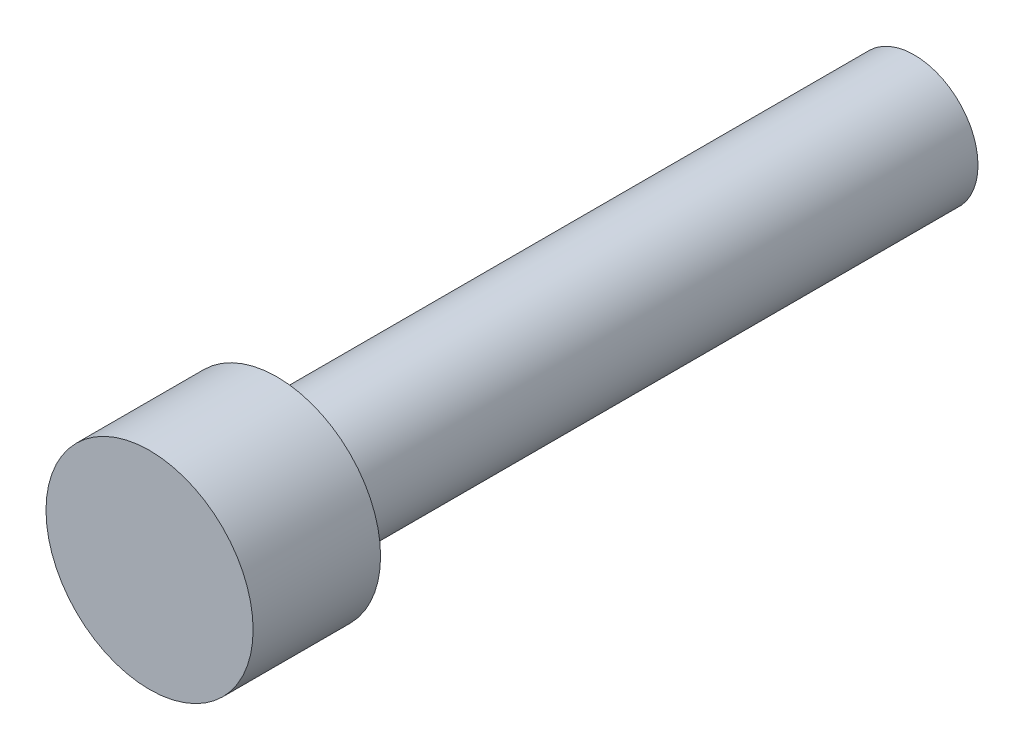
ISO-10303-21;
HEADER;
FILE_DESCRIPTION(('STEP AP214'),'2;1');
FILE_NAME('part.step','',(''),(''),'','','');
FILE_SCHEMA(('AUTOMOTIVE_DESIGN { 1 0 10303 214 1 1 1 1 }'));
ENDSEC;
DATA;
#1=APPLICATION_CONTEXT('core data for automotive mechanical design processes');
#2=APPLICATION_PROTOCOL_DEFINITION('international standard','automotive_design',2000,#1);
#3=PRODUCT_CONTEXT('',#1,'mechanical');
#4=PRODUCT('Part','Part','',(#3));
#5=PRODUCT_RELATED_PRODUCT_CATEGORY('part','',(#4));
#6=PRODUCT_DEFINITION_FORMATION('','',#4);
#7=PRODUCT_DEFINITION_CONTEXT('part definition',#1,'design');
#8=PRODUCT_DEFINITION('design','',#6,#7);
#9=PRODUCT_DEFINITION_SHAPE('','',#8);
#10=(LENGTH_UNIT() NAMED_UNIT(*) SI_UNIT(.MILLI.,.METRE.));
#11=(NAMED_UNIT(*) PLANE_ANGLE_UNIT() SI_UNIT($,.RADIAN.));
#12=(NAMED_UNIT(*) SI_UNIT($,.STERADIAN.) SOLID_ANGLE_UNIT());
#13=UNCERTAINTY_MEASURE_WITH_UNIT(LENGTH_MEASURE(1.E-05),#10,'distance_accuracy_value','');
#14=(GEOMETRIC_REPRESENTATION_CONTEXT(3) GLOBAL_UNCERTAINTY_ASSIGNED_CONTEXT((#13)) GLOBAL_UNIT_ASSIGNED_CONTEXT((#10,
#11,#12)) REPRESENTATION_CONTEXT('',''));
#15=CARTESIAN_POINT('',(0.,0.,0.));
#16=DIRECTION('',(0.,0.,1.));
#17=DIRECTION('',(1.,0.,0.));
#18=AXIS2_PLACEMENT_3D('',#15,#16,#17);
#19=CARTESIAN_POINT('',(0.,0.,8.));
#20=DIRECTION('',(0.,0.,-1.));
#21=DIRECTION('',(-1.,0.,0.));
#22=AXIS2_PLACEMENT_3D('',#19,#20,#21);
#23=CYLINDRICAL_SURFACE('',#22,6.5);
#24=CARTESIAN_POINT('',(0.,0.,8.));
#25=DIRECTION('',(0.,0.,1.));
#26=DIRECTION('',(1.,0.,0.));
#27=AXIS2_PLACEMENT_3D('',#24,#25,#26);
#28=CIRCLE('',#27,6.5);
#29=CARTESIAN_POINT('',(6.5,0.,8.));
#30=VERTEX_POINT('',#29);
#31=EDGE_CURVE('E10',#30,#30,#28,.T.);
#32=ORIENTED_EDGE('',*,*,#31,.F.);
#33=EDGE_LOOP('',(#32));
#34=FACE_BOUND('',#33,.T.);
#35=CARTESIAN_POINT('',(0.,0.,0.));
#36=DIRECTION('',(0.,0.,1.));
#37=DIRECTION('',(1.,0.,0.));
#38=AXIS2_PLACEMENT_3D('',#35,#36,#37);
#39=CIRCLE('',#38,6.5);
#40=CARTESIAN_POINT('',(6.5,0.,0.));
#41=VERTEX_POINT('',#40);
#42=EDGE_CURVE('E37',#41,#41,#39,.T.);
#43=ORIENTED_EDGE('',*,*,#42,.T.);
#44=EDGE_LOOP('',(#43));
#45=FACE_BOUND('',#44,.T.);
#46=ADVANCED_FACE('F40',(#34,#45),#23,.T.);
#47=CARTESIAN_POINT('',(0.,0.,8.));
#48=DIRECTION('',(0.,0.,1.));
#49=DIRECTION('',(1.,0.,0.));
#50=AXIS2_PLACEMENT_3D('',#47,#48,#49);
#51=PLANE('',#50);
#52=ORIENTED_EDGE('',*,*,#31,.T.);
#53=EDGE_LOOP('',(#52));
#54=FACE_BOUND('',#53,.T.);
#55=ADVANCED_FACE('F70',(#54),#51,.T.);
#56=CARTESIAN_POINT('',(0.,0.,0.));
#57=DIRECTION('',(0.,0.,1.));
#58=DIRECTION('',(1.,0.,0.));
#59=AXIS2_PLACEMENT_3D('',#56,#57,#58);
#60=PLANE('',#59);
#61=CARTESIAN_POINT('',(0.,0.,0.));
#62=DIRECTION('',(0.,0.,1.));
#63=DIRECTION('',(1.,0.,0.));
#64=AXIS2_PLACEMENT_3D('',#61,#62,#63);
#65=CIRCLE('',#64,4.);
#66=CARTESIAN_POINT('',(4.,0.,0.));
#67=VERTEX_POINT('',#66);
#68=EDGE_CURVE('E47',#67,#67,#65,.T.);
#69=ORIENTED_EDGE('',*,*,#68,.T.);
#70=EDGE_LOOP('',(#69));
#71=FACE_BOUND('',#70,.T.);
#72=ORIENTED_EDGE('',*,*,#42,.F.);
#73=EDGE_LOOP('',(#72));
#74=FACE_BOUND('',#73,.T.);
#75=ADVANCED_FACE('F65',(#71,#74),#60,.F.);
#76=CARTESIAN_POINT('',(0.,0.,-40.));
#77=DIRECTION('',(0.,0.,1.));
#78=DIRECTION('',(1.,0.,0.));
#79=AXIS2_PLACEMENT_3D('',#76,#77,#78);
#80=CYLINDRICAL_SURFACE('',#79,4.);
#81=CARTESIAN_POINT('',(0.,0.,-40.));
#82=DIRECTION('',(0.,0.,1.));
#83=DIRECTION('',(1.,0.,0.));
#84=AXIS2_PLACEMENT_3D('',#81,#82,#83);
#85=CIRCLE('',#84,4.);
#86=CARTESIAN_POINT('',(4.,0.,-40.));
#87=VERTEX_POINT('',#86);
#88=EDGE_CURVE('E50',#87,#87,#85,.T.);
#89=ORIENTED_EDGE('',*,*,#88,.T.);
#90=EDGE_LOOP('',(#89));
#91=FACE_BOUND('',#90,.T.);
#92=ORIENTED_EDGE('',*,*,#68,.F.);
#93=EDGE_LOOP('',(#92));
#94=FACE_BOUND('',#93,.T.);
#95=ADVANCED_FACE('F54',(#91,#94),#80,.T.);
#96=CARTESIAN_POINT('',(0.,0.,-40.));
#97=DIRECTION('',(0.,0.,1.));
#98=DIRECTION('',(1.,0.,0.));
#99=AXIS2_PLACEMENT_3D('',#96,#97,#98);
#100=PLANE('',#99);
#101=ORIENTED_EDGE('',*,*,#88,.F.);
#102=EDGE_LOOP('',(#101));
#103=FACE_BOUND('',#102,.T.);
#104=ADVANCED_FACE('F59',(#103),#100,.F.);
#105=CLOSED_SHELL('',(#46,#55,#75,#95,#104));
#106=MANIFOLD_SOLID_BREP('B2',#105);
#107=ADVANCED_BREP_SHAPE_REPRESENTATION('',(#18,#106),#14);
#108=SHAPE_DEFINITION_REPRESENTATION(#9,#107);
ENDSEC;
END-ISO-10303-21;
